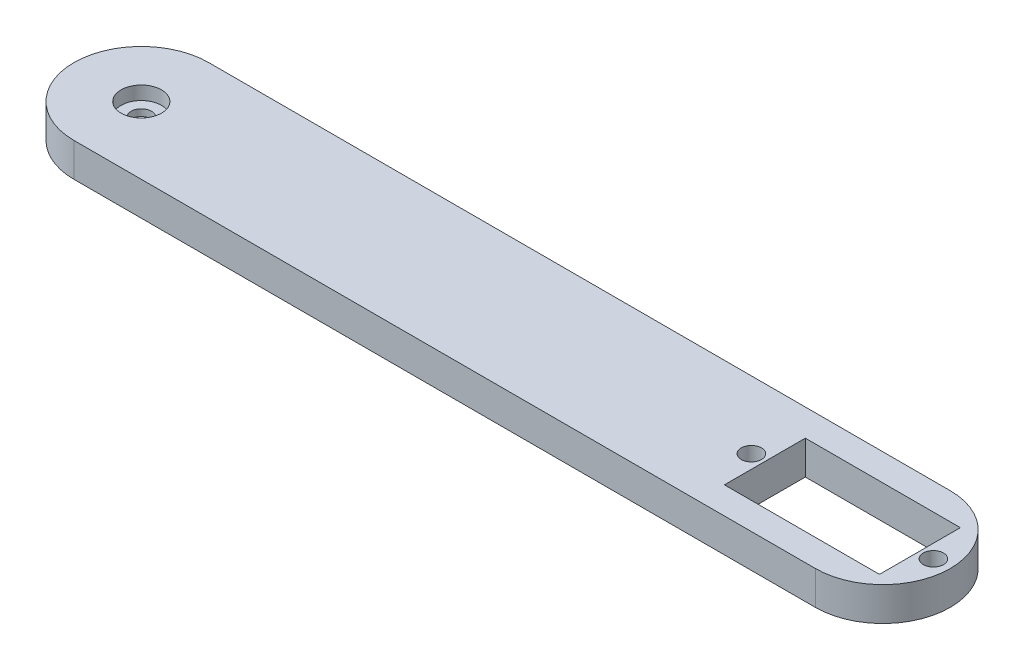
ISO-10303-21;
HEADER;
FILE_DESCRIPTION(('STEP AP214'),'2;1');
FILE_NAME('part.step','',(''),(''),'','','');
FILE_SCHEMA(('AUTOMOTIVE_DESIGN { 1 0 10303 214 1 1 1 1 }'));
ENDSEC;
DATA;
#1=APPLICATION_CONTEXT('core data for automotive mechanical design processes');
#2=APPLICATION_PROTOCOL_DEFINITION('international standard','automotive_design',2000,#1);
#3=PRODUCT_CONTEXT('',#1,'mechanical');
#4=PRODUCT('Part','Part','',(#3));
#5=PRODUCT_RELATED_PRODUCT_CATEGORY('part','',(#4));
#6=PRODUCT_DEFINITION_FORMATION('','',#4);
#7=PRODUCT_DEFINITION_CONTEXT('part definition',#1,'design');
#8=PRODUCT_DEFINITION('design','',#6,#7);
#9=PRODUCT_DEFINITION_SHAPE('','',#8);
#10=(LENGTH_UNIT() NAMED_UNIT(*) SI_UNIT(.MILLI.,.METRE.));
#11=(NAMED_UNIT(*) PLANE_ANGLE_UNIT() SI_UNIT($,.RADIAN.));
#12=(NAMED_UNIT(*) SI_UNIT($,.STERADIAN.) SOLID_ANGLE_UNIT());
#13=UNCERTAINTY_MEASURE_WITH_UNIT(LENGTH_MEASURE(1.E-05),#10,'distance_accuracy_value','');
#14=(GEOMETRIC_REPRESENTATION_CONTEXT(3) GLOBAL_UNCERTAINTY_ASSIGNED_CONTEXT((#13)) GLOBAL_UNIT_ASSIGNED_CONTEXT((#10,
#11,#12)) REPRESENTATION_CONTEXT('',''));
#15=CARTESIAN_POINT('',(0.,0.,0.));
#16=DIRECTION('',(0.,0.,1.));
#17=DIRECTION('',(1.,0.,0.));
#18=AXIS2_PLACEMENT_3D('',#15,#16,#17);
#19=CARTESIAN_POINT('',(40.,5.,0.));
#20=DIRECTION('',(0.,-1.,0.));
#21=DIRECTION('',(0.,0.,-1.));
#22=AXIS2_PLACEMENT_3D('',#19,#20,#21);
#23=CYLINDRICAL_SURFACE('',#22,10.);
#24=CARTESIAN_POINT('',(40.,0.,0.));
#25=DIRECTION('',(0.,1.,0.));
#26=DIRECTION('',(0.,0.,1.));
#27=AXIS2_PLACEMENT_3D('',#24,#25,#26);
#28=CIRCLE('',#27,10.);
#29=CARTESIAN_POINT('',(40.,0.,10.));
#30=VERTEX_POINT('',#29);
#31=CARTESIAN_POINT('',(40.,0.,-10.));
#32=VERTEX_POINT('',#31);
#33=EDGE_CURVE('E277',#30,#32,#28,.T.);
#34=ORIENTED_EDGE('',*,*,#33,.T.);
#35=DIRECTION('',(0.,-1.,0.));
#36=VECTOR('',#35,1.);
#37=CARTESIAN_POINT('',(40.,5.,-10.));
#38=LINE('',#37,#36);
#39=CARTESIAN_POINT('',(40.,5.,-10.));
#40=VERTEX_POINT('',#39);
#41=EDGE_CURVE('E325',#40,#32,#38,.T.);
#42=ORIENTED_EDGE('',*,*,#41,.F.);
#43=CARTESIAN_POINT('',(40.,5.,0.));
#44=DIRECTION('',(0.,1.,0.));
#45=DIRECTION('',(0.,0.,1.));
#46=AXIS2_PLACEMENT_3D('',#43,#44,#45);
#47=CIRCLE('',#46,10.);
#48=CARTESIAN_POINT('',(40.,5.,10.));
#49=VERTEX_POINT('',#48);
#50=EDGE_CURVE('E286',#49,#40,#47,.T.);
#51=ORIENTED_EDGE('',*,*,#50,.F.);
#52=DIRECTION('',(0.,-1.,0.));
#53=VECTOR('',#52,1.);
#54=CARTESIAN_POINT('',(40.,5.,10.));
#55=LINE('',#54,#53);
#56=EDGE_CURVE('E300',#49,#30,#55,.T.);
#57=ORIENTED_EDGE('',*,*,#56,.T.);
#58=EDGE_LOOP('',(#34,#42,#51,#57));
#59=FACE_BOUND('',#58,.T.);
#60=ADVANCED_FACE('F43',(#59),#23,.T.);
#61=CARTESIAN_POINT('',(-40.,5.,-10.));
#62=DIRECTION('',(0.,0.,1.));
#63=DIRECTION('',(1.,0.,0.));
#64=AXIS2_PLACEMENT_3D('',#61,#62,#63);
#65=PLANE('',#64);
#66=DIRECTION('',(-1.,0.,0.));
#67=VECTOR('',#66,1.);
#68=CARTESIAN_POINT('',(-40.,0.,-10.));
#69=LINE('',#68,#67);
#70=CARTESIAN_POINT('',(-70.,0.,-9.99999999999999));
#71=VERTEX_POINT('',#70);
#72=EDGE_CURVE('E304',#32,#71,#69,.T.);
#73=ORIENTED_EDGE('',*,*,#72,.T.);
#74=DIRECTION('',(0.,-1.,0.));
#75=VECTOR('',#74,1.);
#76=CARTESIAN_POINT('',(-70.,5.,-9.99999999999999));
#77=LINE('',#76,#75);
#78=CARTESIAN_POINT('',(-70.,5.,-9.99999999999999));
#79=VERTEX_POINT('',#78);
#80=EDGE_CURVE('E321',#79,#71,#77,.T.);
#81=ORIENTED_EDGE('',*,*,#80,.F.);
#82=DIRECTION('',(-1.,0.,0.));
#83=VECTOR('',#82,1.);
#84=CARTESIAN_POINT('',(-40.,5.,-10.));
#85=LINE('',#84,#83);
#86=EDGE_CURVE('E290',#40,#79,#85,.T.);
#87=ORIENTED_EDGE('',*,*,#86,.F.);
#88=ORIENTED_EDGE('',*,*,#41,.T.);
#89=EDGE_LOOP('',(#73,#81,#87,#88));
#90=FACE_BOUND('',#89,.T.);
#91=ADVANCED_FACE('F346',(#90),#65,.F.);
#92=CARTESIAN_POINT('',(-70.,5.,0.));
#93=DIRECTION('',(0.,-1.,0.));
#94=DIRECTION('',(0.,0.,-1.));
#95=AXIS2_PLACEMENT_3D('',#92,#93,#94);
#96=CYLINDRICAL_SURFACE('',#95,10.);
#97=CARTESIAN_POINT('',(-70.,0.,0.));
#98=DIRECTION('',(0.,1.,0.));
#99=DIRECTION('',(0.,0.,1.));
#100=AXIS2_PLACEMENT_3D('',#97,#98,#99);
#101=CIRCLE('',#100,10.);
#102=CARTESIAN_POINT('',(-78.6702117455341,0.,-4.98271294453153));
#103=VERTEX_POINT('',#102);
#104=EDGE_CURVE('E308',#71,#103,#101,.T.);
#105=ORIENTED_EDGE('',*,*,#104,.T.);
#106=DIRECTION('',(0.,-1.,0.));
#107=VECTOR('',#106,1.);
#108=CARTESIAN_POINT('',(-78.6702117455341,5.,-4.98271294453153));
#109=LINE('',#108,#107);
#110=CARTESIAN_POINT('',(-78.6702117455341,2.,-4.98271294453153));
#111=VERTEX_POINT('',#110);
#112=EDGE_CURVE('E216',#103,#111,#109,.F.);
#113=ORIENTED_EDGE('',*,*,#112,.T.);
#114=CARTESIAN_POINT('',(-70.,2.,0.));
#115=DIRECTION('',(0.,-1.,0.));
#116=DIRECTION('',(0.,0.,-1.));
#117=AXIS2_PLACEMENT_3D('',#114,#115,#116);
#118=CIRCLE('',#117,10.);
#119=CARTESIAN_POINT('',(-78.6317978282409,2.,5.04896684999772));
#120=VERTEX_POINT('',#119);
#121=EDGE_CURVE('E11',#120,#111,#118,.T.);
#122=ORIENTED_EDGE('',*,*,#121,.F.);
#123=DIRECTION('',(0.,-1.,0.));
#124=VECTOR('',#123,1.);
#125=CARTESIAN_POINT('',(-78.6317978282409,5.,5.04896684999772));
#126=LINE('',#125,#124);
#127=CARTESIAN_POINT('',(-78.6317978282409,0.,5.04896684999772));
#128=VERTEX_POINT('',#127);
#129=EDGE_CURVE('E205',#128,#120,#126,.F.);
#130=ORIENTED_EDGE('',*,*,#129,.F.);
#131=CARTESIAN_POINT('',(-70.,0.,10.));
#132=VERTEX_POINT('',#131);
#133=EDGE_CURVE('E307',#128,#132,#101,.T.);
#134=ORIENTED_EDGE('',*,*,#133,.T.);
#135=DIRECTION('',(0.,-1.,0.));
#136=VECTOR('',#135,1.);
#137=CARTESIAN_POINT('',(-70.,5.,10.));
#138=LINE('',#137,#136);
#139=CARTESIAN_POINT('',(-70.,5.,10.));
#140=VERTEX_POINT('',#139);
#141=EDGE_CURVE('E317',#140,#132,#138,.T.);
#142=ORIENTED_EDGE('',*,*,#141,.F.);
#143=CARTESIAN_POINT('',(-70.,5.,0.));
#144=DIRECTION('',(0.,1.,0.));
#145=DIRECTION('',(0.,0.,1.));
#146=AXIS2_PLACEMENT_3D('',#143,#144,#145);
#147=CIRCLE('',#146,10.);
#148=EDGE_CURVE('E294',#79,#140,#147,.T.);
#149=ORIENTED_EDGE('',*,*,#148,.F.);
#150=ORIENTED_EDGE('',*,*,#80,.T.);
#151=EDGE_LOOP('',(#105,#113,#122,#130,#134,#142,#149,#150));
#152=FACE_BOUND('',#151,.T.);
#153=ADVANCED_FACE('F340',(#152),#96,.T.);
#154=CARTESIAN_POINT('',(-40.,5.,10.));
#155=DIRECTION('',(0.,0.,-1.));
#156=DIRECTION('',(-1.,0.,0.));
#157=AXIS2_PLACEMENT_3D('',#154,#155,#156);
#158=PLANE('',#157);
#159=DIRECTION('',(1.,0.,0.));
#160=VECTOR('',#159,1.);
#161=CARTESIAN_POINT('',(-40.,0.,10.));
#162=LINE('',#161,#160);
#163=EDGE_CURVE('E291',#132,#30,#162,.T.);
#164=ORIENTED_EDGE('',*,*,#163,.T.);
#165=ORIENTED_EDGE('',*,*,#56,.F.);
#166=DIRECTION('',(1.,0.,0.));
#167=VECTOR('',#166,1.);
#168=CARTESIAN_POINT('',(-40.,5.,10.));
#169=LINE('',#168,#167);
#170=EDGE_CURVE('E297',#140,#49,#169,.T.);
#171=ORIENTED_EDGE('',*,*,#170,.F.);
#172=ORIENTED_EDGE('',*,*,#141,.T.);
#173=EDGE_LOOP('',(#164,#165,#171,#172));
#174=FACE_BOUND('',#173,.T.);
#175=ADVANCED_FACE('F356',(#174),#158,.F.);
#176=CARTESIAN_POINT('',(40.,5.,0.));
#177=DIRECTION('',(0.,1.,0.));
#178=DIRECTION('',(0.,0.,1.));
#179=AXIS2_PLACEMENT_3D('',#176,#177,#178);
#180=PLANE('',#179);
#181=CARTESIAN_POINT('',(-70.,5.,0.));
#182=DIRECTION('',(0.,1.,0.));
#183=DIRECTION('',(0.,0.,1.));
#184=AXIS2_PLACEMENT_3D('',#181,#182,#183);
#185=CIRCLE('',#184,3.00000000000001);
#186=CARTESIAN_POINT('',(-70.,5.,3.00000000000001));
#187=VERTEX_POINT('',#186);
#188=EDGE_CURVE('E220',#187,#187,#185,.T.);
#189=ORIENTED_EDGE('',*,*,#188,.F.);
#190=EDGE_LOOP('',(#189));
#191=FACE_BOUND('',#190,.T.);
#192=CARTESIAN_POINT('',(47.5,5.,0.));
#193=DIRECTION('',(0.,1.,0.));
#194=DIRECTION('',(0.,0.,1.));
#195=AXIS2_PLACEMENT_3D('',#192,#193,#194);
#196=CIRCLE('',#195,1.5);
#197=CARTESIAN_POINT('',(47.5,5.,1.5));
#198=VERTEX_POINT('',#197);
#199=EDGE_CURVE('E237',#198,#198,#196,.T.);
#200=ORIENTED_EDGE('',*,*,#199,.F.);
#201=EDGE_LOOP('',(#200));
#202=FACE_BOUND('',#201,.T.);
#203=CARTESIAN_POINT('',(20.5,5.,0.));
#204=DIRECTION('',(0.,1.,0.));
#205=DIRECTION('',(0.,0.,1.));
#206=AXIS2_PLACEMENT_3D('',#203,#204,#205);
#207=CIRCLE('',#206,1.5);
#208=CARTESIAN_POINT('',(20.5,5.,1.5));
#209=VERTEX_POINT('',#208);
#210=EDGE_CURVE('E229',#209,#209,#207,.T.);
#211=ORIENTED_EDGE('',*,*,#210,.F.);
#212=EDGE_LOOP('',(#211));
#213=FACE_BOUND('',#212,.T.);
#214=DIRECTION('',(0.,0.,1.));
#215=VECTOR('',#214,1.);
#216=CARTESIAN_POINT('',(22.5,5.,0.));
#217=LINE('',#216,#215);
#218=CARTESIAN_POINT('',(22.5,5.,-6.));
#219=VERTEX_POINT('',#218);
#220=CARTESIAN_POINT('',(22.5,5.,6.));
#221=VERTEX_POINT('',#220);
#222=EDGE_CURVE('E67',#219,#221,#217,.T.);
#223=ORIENTED_EDGE('',*,*,#222,.F.);
#224=DIRECTION('',(1.,0.,0.));
#225=VECTOR('',#224,1.);
#226=CARTESIAN_POINT('',(0.,5.,-6.));
#227=LINE('',#226,#225);
#228=CARTESIAN_POINT('',(45.5,5.,-6.));
#229=VERTEX_POINT('',#228);
#230=EDGE_CURVE('E249',#219,#229,#227,.T.);
#231=ORIENTED_EDGE('',*,*,#230,.T.);
#232=DIRECTION('',(0.,0.,1.));
#233=VECTOR('',#232,1.);
#234=CARTESIAN_POINT('',(45.5,5.,0.));
#235=LINE('',#234,#233);
#236=CARTESIAN_POINT('',(45.5,5.,6.));
#237=VERTEX_POINT('',#236);
#238=EDGE_CURVE('E267',#229,#237,#235,.T.);
#239=ORIENTED_EDGE('',*,*,#238,.T.);
#240=DIRECTION('',(1.,0.,0.));
#241=VECTOR('',#240,1.);
#242=CARTESIAN_POINT('',(0.,5.,6.));
#243=LINE('',#242,#241);
#244=EDGE_CURVE('E263',#221,#237,#243,.T.);
#245=ORIENTED_EDGE('',*,*,#244,.F.);
#246=EDGE_LOOP('',(#223,#231,#239,#245));
#247=FACE_BOUND('',#246,.T.);
#248=ORIENTED_EDGE('',*,*,#50,.T.);
#249=ORIENTED_EDGE('',*,*,#86,.T.);
#250=ORIENTED_EDGE('',*,*,#148,.T.);
#251=ORIENTED_EDGE('',*,*,#170,.T.);
#252=EDGE_LOOP('',(#248,#249,#250,#251));
#253=FACE_BOUND('',#252,.T.);
#254=ADVANCED_FACE('F394',(#191,#202,#213,#247,#253),#180,.T.);
#255=CARTESIAN_POINT('',(40.,0.,0.));
#256=DIRECTION('',(0.,1.,0.));
#257=DIRECTION('',(0.,0.,1.));
#258=AXIS2_PLACEMENT_3D('',#255,#256,#257);
#259=PLANE('',#258);
#260=DIRECTION('',(0.985030467155704,0.,0.172380331752248));
#261=VECTOR('',#260,1.);
#262=CARTESIAN_POINT('',(-0.97634930260764,0.,5.57913887204366));
#263=LINE('',#262,#261);
#264=CARTESIAN_POINT('',(-70.,0.,-6.49999999999999));
#265=VERTEX_POINT('',#264);
#266=CARTESIAN_POINT('',(-50.,0.,-3.));
#267=VERTEX_POINT('',#266);
#268=EDGE_CURVE('E59',#265,#267,#263,.T.);
#269=ORIENTED_EDGE('',*,*,#268,.F.);
#270=DIRECTION('',(-0.985030467155704,0.,0.172380331752248));
#271=VECTOR('',#270,1.);
#272=CARTESIAN_POINT('',(35.6276531231049,0.,-24.9848392965433));
#273=LINE('',#272,#271);
#274=EDGE_CURVE('E52',#265,#103,#273,.T.);
#275=ORIENTED_EDGE('',*,*,#274,.T.);
#276=ORIENTED_EDGE('',*,*,#104,.F.);
#277=ORIENTED_EDGE('',*,*,#72,.F.);
#278=ORIENTED_EDGE('',*,*,#33,.F.);
#279=ORIENTED_EDGE('',*,*,#163,.F.);
#280=ORIENTED_EDGE('',*,*,#133,.F.);
#281=DIRECTION('',(-0.984142689594404,0.,-0.177378596560839));
#282=VECTOR('',#281,1.);
#283=CARTESIAN_POINT('',(35.3860908053863,0.,25.5991708829088));
#284=LINE('',#283,#282);
#285=CARTESIAN_POINT('',(-71.1529608776454,0.,6.39692748236363));
#286=VERTEX_POINT('',#285);
#287=EDGE_CURVE('E329',#286,#128,#284,.T.);
#288=ORIENTED_EDGE('',*,*,#287,.F.);
#289=CARTESIAN_POINT('',(-70.,0.,0.));
#290=DIRECTION('',(0.,-1.,0.));
#291=DIRECTION('',(0.,0.,-1.));
#292=AXIS2_PLACEMENT_3D('',#289,#290,#291);
#293=CIRCLE('',#292,6.5);
#294=CARTESIAN_POINT('',(-68.8470391223545,0.,6.39692748236363));
#295=VERTEX_POINT('',#294);
#296=EDGE_CURVE('E174',#295,#286,#293,.T.);
#297=ORIENTED_EDGE('',*,*,#296,.F.);
#298=DIRECTION('',(-0.984142689594404,0.,0.177378596560839));
#299=VECTOR('',#298,1.);
#300=CARTESIAN_POINT('',(-1.04946077860705,0.,-5.82268195434692));
#301=LINE('',#300,#299);
#302=CARTESIAN_POINT('',(-50.,0.,3.00000000000001));
#303=VERTEX_POINT('',#302);
#304=EDGE_CURVE('E178',#303,#295,#301,.T.);
#305=ORIENTED_EDGE('',*,*,#304,.F.);
#306=CARTESIAN_POINT('',(-50.,0.,0.));
#307=DIRECTION('',(0.,-1.,0.));
#308=DIRECTION('',(0.,0.,-1.));
#309=AXIS2_PLACEMENT_3D('',#306,#307,#308);
#310=CIRCLE('',#309,3.);
#311=EDGE_CURVE('E196',#267,#303,#310,.T.);
#312=ORIENTED_EDGE('',*,*,#311,.F.);
#313=EDGE_LOOP('',(#269,#275,#276,#277,#278,#279,#280,#288,#297,#305,#312));
#314=FACE_BOUND('',#313,.T.);
#315=CARTESIAN_POINT('',(47.5,0.,0.));
#316=DIRECTION('',(0.,1.,0.));
#317=DIRECTION('',(0.,0.,1.));
#318=AXIS2_PLACEMENT_3D('',#315,#316,#317);
#319=CIRCLE('',#318,1.5);
#320=CARTESIAN_POINT('',(47.5,0.,1.5));
#321=VERTEX_POINT('',#320);
#322=EDGE_CURVE('E225',#321,#321,#319,.T.);
#323=ORIENTED_EDGE('',*,*,#322,.T.);
#324=EDGE_LOOP('',(#323));
#325=FACE_BOUND('',#324,.T.);
#326=CARTESIAN_POINT('',(20.5,0.,0.));
#327=DIRECTION('',(0.,1.,0.));
#328=DIRECTION('',(0.,0.,1.));
#329=AXIS2_PLACEMENT_3D('',#326,#327,#328);
#330=CIRCLE('',#329,1.5);
#331=CARTESIAN_POINT('',(20.5,0.,1.5));
#332=VERTEX_POINT('',#331);
#333=EDGE_CURVE('E233',#332,#332,#330,.T.);
#334=ORIENTED_EDGE('',*,*,#333,.T.);
#335=EDGE_LOOP('',(#334));
#336=FACE_BOUND('',#335,.T.);
#337=DIRECTION('',(1.,0.,0.));
#338=VECTOR('',#337,1.);
#339=CARTESIAN_POINT('',(0.,0.,-6.));
#340=LINE('',#339,#338);
#341=CARTESIAN_POINT('',(22.5,0.,-6.));
#342=VERTEX_POINT('',#341);
#343=CARTESIAN_POINT('',(45.5,0.,-6.));
#344=VERTEX_POINT('',#343);
#345=EDGE_CURVE('E257',#342,#344,#340,.T.);
#346=ORIENTED_EDGE('',*,*,#345,.F.);
#347=DIRECTION('',(0.,0.,1.));
#348=VECTOR('',#347,1.);
#349=CARTESIAN_POINT('',(22.5,0.,0.));
#350=LINE('',#349,#348);
#351=CARTESIAN_POINT('',(22.5,0.,6.));
#352=VERTEX_POINT('',#351);
#353=EDGE_CURVE('E244',#342,#352,#350,.T.);
#354=ORIENTED_EDGE('',*,*,#353,.T.);
#355=DIRECTION('',(1.,0.,0.));
#356=VECTOR('',#355,1.);
#357=CARTESIAN_POINT('',(0.,0.,6.));
#358=LINE('',#357,#356);
#359=CARTESIAN_POINT('',(45.5,0.,6.));
#360=VERTEX_POINT('',#359);
#361=EDGE_CURVE('E248',#352,#360,#358,.T.);
#362=ORIENTED_EDGE('',*,*,#361,.T.);
#363=DIRECTION('',(0.,0.,1.));
#364=VECTOR('',#363,1.);
#365=CARTESIAN_POINT('',(45.5,0.,0.));
#366=LINE('',#365,#364);
#367=EDGE_CURVE('E253',#344,#360,#366,.T.);
#368=ORIENTED_EDGE('',*,*,#367,.F.);
#369=EDGE_LOOP('',(#346,#354,#362,#368));
#370=FACE_BOUND('',#369,.T.);
#371=ADVANCED_FACE('F336',(#314,#325,#336,#370),#259,.F.);
#372=CARTESIAN_POINT('',(22.5,0.,0.));
#373=DIRECTION('',(-1.,0.,0.));
#374=DIRECTION('',(0.,0.,1.));
#375=AXIS2_PLACEMENT_3D('',#372,#373,#374);
#376=PLANE('',#375);
#377=ORIENTED_EDGE('',*,*,#222,.T.);
#378=DIRECTION('',(0.,1.,0.));
#379=VECTOR('',#378,1.);
#380=CARTESIAN_POINT('',(22.5,0.,6.));
#381=LINE('',#380,#379);
#382=EDGE_CURVE('E260',#352,#221,#381,.T.);
#383=ORIENTED_EDGE('',*,*,#382,.F.);
#384=ORIENTED_EDGE('',*,*,#353,.F.);
#385=DIRECTION('',(0.,1.,0.));
#386=VECTOR('',#385,1.);
#387=CARTESIAN_POINT('',(22.5,0.,-6.));
#388=LINE('',#387,#386);
#389=EDGE_CURVE('E274',#342,#219,#388,.T.);
#390=ORIENTED_EDGE('',*,*,#389,.T.);
#391=EDGE_LOOP('',(#377,#383,#384,#390));
#392=FACE_BOUND('',#391,.T.);
#393=ADVANCED_FACE('F397',(#392),#376,.F.);
#394=CARTESIAN_POINT('',(0.,0.,-6.));
#395=DIRECTION('',(0.,0.,1.));
#396=DIRECTION('',(1.,0.,0.));
#397=AXIS2_PLACEMENT_3D('',#394,#395,#396);
#398=PLANE('',#397);
#399=ORIENTED_EDGE('',*,*,#230,.F.);
#400=ORIENTED_EDGE('',*,*,#389,.F.);
#401=ORIENTED_EDGE('',*,*,#345,.T.);
#402=DIRECTION('',(0.,1.,0.));
#403=VECTOR('',#402,1.);
#404=CARTESIAN_POINT('',(45.5,0.,-6.));
#405=LINE('',#404,#403);
#406=EDGE_CURVE('E278',#344,#229,#405,.T.);
#407=ORIENTED_EDGE('',*,*,#406,.T.);
#408=EDGE_LOOP('',(#399,#400,#401,#407));
#409=FACE_BOUND('',#408,.T.);
#410=ADVANCED_FACE('F403',(#409),#398,.T.);
#411=CARTESIAN_POINT('',(45.5,0.,0.));
#412=DIRECTION('',(-1.,0.,0.));
#413=DIRECTION('',(0.,0.,1.));
#414=AXIS2_PLACEMENT_3D('',#411,#412,#413);
#415=PLANE('',#414);
#416=ORIENTED_EDGE('',*,*,#238,.F.);
#417=ORIENTED_EDGE('',*,*,#406,.F.);
#418=ORIENTED_EDGE('',*,*,#367,.T.);
#419=DIRECTION('',(0.,1.,0.));
#420=VECTOR('',#419,1.);
#421=CARTESIAN_POINT('',(45.5,0.,6.));
#422=LINE('',#421,#420);
#423=EDGE_CURVE('E281',#360,#237,#422,.T.);
#424=ORIENTED_EDGE('',*,*,#423,.T.);
#425=EDGE_LOOP('',(#416,#417,#418,#424));
#426=FACE_BOUND('',#425,.T.);
#427=ADVANCED_FACE('F408',(#426),#415,.T.);
#428=CARTESIAN_POINT('',(0.,0.,6.));
#429=DIRECTION('',(0.,0.,1.));
#430=DIRECTION('',(1.,0.,0.));
#431=AXIS2_PLACEMENT_3D('',#428,#429,#430);
#432=PLANE('',#431);
#433=ORIENTED_EDGE('',*,*,#244,.T.);
#434=ORIENTED_EDGE('',*,*,#423,.F.);
#435=ORIENTED_EDGE('',*,*,#361,.F.);
#436=ORIENTED_EDGE('',*,*,#382,.T.);
#437=EDGE_LOOP('',(#433,#434,#435,#436));
#438=FACE_BOUND('',#437,.T.);
#439=ADVANCED_FACE('F404',(#438),#432,.F.);
#440=CARTESIAN_POINT('',(20.5,0.,0.));
#441=DIRECTION('',(0.,1.,0.));
#442=DIRECTION('',(0.,0.,1.));
#443=AXIS2_PLACEMENT_3D('',#440,#441,#442);
#444=CYLINDRICAL_SURFACE('',#443,1.5);
#445=ORIENTED_EDGE('',*,*,#333,.F.);
#446=EDGE_LOOP('',(#445));
#447=FACE_BOUND('',#446,.T.);
#448=ORIENTED_EDGE('',*,*,#210,.T.);
#449=EDGE_LOOP('',(#448));
#450=FACE_BOUND('',#449,.T.);
#451=ADVANCED_FACE('F407',(#447,#450),#444,.F.);
#452=CARTESIAN_POINT('',(47.5,0.,0.));
#453=DIRECTION('',(0.,1.,0.));
#454=DIRECTION('',(0.,0.,1.));
#455=AXIS2_PLACEMENT_3D('',#452,#453,#454);
#456=CYLINDRICAL_SURFACE('',#455,1.5);
#457=ORIENTED_EDGE('',*,*,#322,.F.);
#458=EDGE_LOOP('',(#457));
#459=FACE_BOUND('',#458,.T.);
#460=ORIENTED_EDGE('',*,*,#199,.T.);
#461=EDGE_LOOP('',(#460));
#462=FACE_BOUND('',#461,.T.);
#463=ADVANCED_FACE('F416',(#459,#462),#456,.F.);
#464=CARTESIAN_POINT('',(-70.,3.,0.));
#465=DIRECTION('',(0.,1.,0.));
#466=DIRECTION('',(0.,0.,1.));
#467=AXIS2_PLACEMENT_3D('',#464,#465,#466);
#468=CYLINDRICAL_SURFACE('',#467,3.00000000000001);
#469=CARTESIAN_POINT('',(-70.,3.,0.));
#470=DIRECTION('',(0.,1.,0.));
#471=DIRECTION('',(0.,0.,1.));
#472=AXIS2_PLACEMENT_3D('',#469,#470,#471);
#473=CIRCLE('',#472,3.00000000000001);
#474=CARTESIAN_POINT('',(-70.,3.,3.00000000000001));
#475=VERTEX_POINT('',#474);
#476=EDGE_CURVE('E221',#475,#475,#473,.T.);
#477=ORIENTED_EDGE('',*,*,#476,.F.);
#478=EDGE_LOOP('',(#477));
#479=FACE_BOUND('',#478,.T.);
#480=ORIENTED_EDGE('',*,*,#188,.T.);
#481=EDGE_LOOP('',(#480));
#482=FACE_BOUND('',#481,.T.);
#483=ADVANCED_FACE('F419',(#479,#482),#468,.F.);
#484=CARTESIAN_POINT('',(-70.,3.,0.));
#485=DIRECTION('',(0.,1.,0.));
#486=DIRECTION('',(0.,0.,1.));
#487=AXIS2_PLACEMENT_3D('',#484,#485,#486);
#488=PLANE('',#487);
#489=CARTESIAN_POINT('',(-70.,3.,0.));
#490=DIRECTION('',(0.,1.,0.));
#491=DIRECTION('',(0.,0.,1.));
#492=AXIS2_PLACEMENT_3D('',#489,#490,#491);
#493=CIRCLE('',#492,1.5);
#494=CARTESIAN_POINT('',(-70.,3.,1.5));
#495=VERTEX_POINT('',#494);
#496=EDGE_CURVE('E181',#495,#495,#493,.T.);
#497=ORIENTED_EDGE('',*,*,#496,.F.);
#498=EDGE_LOOP('',(#497));
#499=FACE_BOUND('',#498,.T.);
#500=ORIENTED_EDGE('',*,*,#476,.T.);
#501=EDGE_LOOP('',(#500));
#502=FACE_BOUND('',#501,.T.);
#503=ADVANCED_FACE('F379',(#499,#502),#488,.T.);
#504=CARTESIAN_POINT('',(0.,2.,0.));
#505=DIRECTION('',(0.,-1.,0.));
#506=DIRECTION('',(0.,0.,-1.));
#507=AXIS2_PLACEMENT_3D('',#504,#505,#506);
#508=PLANE('',#507);
#509=CARTESIAN_POINT('',(-70.,2.,0.));
#510=DIRECTION('',(0.,-1.,0.));
#511=DIRECTION('',(0.,0.,-1.));
#512=AXIS2_PLACEMENT_3D('',#509,#510,#511);
#513=CIRCLE('',#512,1.5);
#514=CARTESIAN_POINT('',(-70.,2.,-1.49999999999999));
#515=VERTEX_POINT('',#514);
#516=EDGE_CURVE('E46',#515,#515,#513,.T.);
#517=ORIENTED_EDGE('',*,*,#516,.F.);
#518=EDGE_LOOP('',(#517));
#519=FACE_BOUND('',#518,.T.);
#520=ORIENTED_EDGE('',*,*,#121,.T.);
#521=DIRECTION('',(0.985030467155704,0.,-0.172380331752248));
#522=VECTOR('',#521,1.);
#523=CARTESIAN_POINT('',(-3.18374772589447,2.,-18.1928441479684));
#524=LINE('',#523,#522);
#525=CARTESIAN_POINT('',(-70.,2.,-6.49999999999999));
#526=VERTEX_POINT('',#525);
#527=EDGE_CURVE('E159',#111,#526,#524,.T.);
#528=ORIENTED_EDGE('',*,*,#527,.T.);
#529=DIRECTION('',(0.985030467155704,0.,0.172380331752248));
#530=VECTOR('',#529,1.);
#531=CARTESIAN_POINT('',(-0.97634930260764,2.,5.57913887204366));
#532=LINE('',#531,#530);
#533=CARTESIAN_POINT('',(-50.,2.,-3.));
#534=VERTEX_POINT('',#533);
#535=EDGE_CURVE('E153',#526,#534,#532,.T.);
#536=ORIENTED_EDGE('',*,*,#535,.T.);
#537=CARTESIAN_POINT('',(-50.,2.,0.));
#538=DIRECTION('',(0.,-1.,0.));
#539=DIRECTION('',(0.,0.,-1.));
#540=AXIS2_PLACEMENT_3D('',#537,#538,#539);
#541=CIRCLE('',#540,3.);
#542=CARTESIAN_POINT('',(-50.,2.,3.00000000000001));
#543=VERTEX_POINT('',#542);
#544=EDGE_CURVE('E162',#534,#543,#541,.T.);
#545=ORIENTED_EDGE('',*,*,#544,.T.);
#546=DIRECTION('',(-0.984142689594404,0.,0.177378596560839));
#547=VECTOR('',#546,1.);
#548=CARTESIAN_POINT('',(-1.04946077860705,2.,-5.82268195434692));
#549=LINE('',#548,#547);
#550=CARTESIAN_POINT('',(-68.8470391223545,2.,6.39692748236363));
#551=VERTEX_POINT('',#550);
#552=EDGE_CURVE('E168',#543,#551,#549,.T.);
#553=ORIENTED_EDGE('',*,*,#552,.T.);
#554=CARTESIAN_POINT('',(-70.,2.,0.));
#555=DIRECTION('',(0.,-1.,0.));
#556=DIRECTION('',(0.,0.,-1.));
#557=AXIS2_PLACEMENT_3D('',#554,#555,#556);
#558=CIRCLE('',#557,6.5);
#559=CARTESIAN_POINT('',(-71.1529608776454,2.,6.39692748236363));
#560=VERTEX_POINT('',#559);
#561=EDGE_CURVE('E185',#551,#560,#558,.T.);
#562=ORIENTED_EDGE('',*,*,#561,.T.);
#563=DIRECTION('',(0.984142689594404,0.,0.177378596560839));
#564=VECTOR('',#563,1.);
#565=CARTESIAN_POINT('',(-3.35538253389796,2.,18.6165369190742));
#566=LINE('',#565,#564);
#567=EDGE_CURVE('E189',#120,#560,#566,.T.);
#568=ORIENTED_EDGE('',*,*,#567,.F.);
#569=EDGE_LOOP('',(#520,#528,#536,#545,#553,#562,#568));
#570=FACE_BOUND('',#569,.T.);
#571=ADVANCED_FACE('F170',(#519,#570),#508,.T.);
#572=CARTESIAN_POINT('',(-3.18374772589447,2.,-18.1928441479684));
#573=DIRECTION('',(-0.172380331752248,0.,-0.985030467155704));
#574=DIRECTION('',(-0.985030467155704,0.,0.172380331752248));
#575=AXIS2_PLACEMENT_3D('',#572,#573,#574);
#576=PLANE('',#575);
#577=ORIENTED_EDGE('',*,*,#274,.F.);
#578=DIRECTION('',(0.,-1.,0.));
#579=VECTOR('',#578,1.);
#580=CARTESIAN_POINT('',(-70.,2.,-6.49999999999999));
#581=LINE('',#580,#579);
#582=EDGE_CURVE('E202',#526,#265,#581,.T.);
#583=ORIENTED_EDGE('',*,*,#582,.F.);
#584=ORIENTED_EDGE('',*,*,#527,.F.);
#585=ORIENTED_EDGE('',*,*,#112,.F.);
#586=EDGE_LOOP('',(#577,#583,#584,#585));
#587=FACE_BOUND('',#586,.T.);
#588=ADVANCED_FACE('F371',(#587),#576,.F.);
#589=CARTESIAN_POINT('',(-3.35538253389796,2.,18.6165369190742));
#590=DIRECTION('',(0.177378596560839,0.,-0.984142689594404));
#591=DIRECTION('',(-0.984142689594404,0.,-0.177378596560839));
#592=AXIS2_PLACEMENT_3D('',#589,#590,#591);
#593=PLANE('',#592);
#594=ORIENTED_EDGE('',*,*,#129,.T.);
#595=ORIENTED_EDGE('',*,*,#567,.T.);
#596=DIRECTION('',(0.,-1.,0.));
#597=VECTOR('',#596,1.);
#598=CARTESIAN_POINT('',(-71.1529608776454,2.,6.39692748236363));
#599=LINE('',#598,#597);
#600=EDGE_CURVE('E206',#560,#286,#599,.T.);
#601=ORIENTED_EDGE('',*,*,#600,.T.);
#602=ORIENTED_EDGE('',*,*,#287,.T.);
#603=EDGE_LOOP('',(#594,#595,#601,#602));
#604=FACE_BOUND('',#603,.T.);
#605=ADVANCED_FACE('F363',(#604),#593,.T.);
#606=CARTESIAN_POINT('',(-0.97634930260764,2.,5.57913887204366));
#607=DIRECTION('',(0.172380331752248,0.,-0.985030467155704));
#608=DIRECTION('',(-0.985030467155704,0.,-0.172380331752248));
#609=AXIS2_PLACEMENT_3D('',#606,#607,#608);
#610=PLANE('',#609);
#611=ORIENTED_EDGE('',*,*,#268,.T.);
#612=DIRECTION('',(0.,-1.,0.));
#613=VECTOR('',#612,1.);
#614=CARTESIAN_POINT('',(-50.,2.,-3.));
#615=LINE('',#614,#613);
#616=EDGE_CURVE('E149',#534,#267,#615,.T.);
#617=ORIENTED_EDGE('',*,*,#616,.F.);
#618=ORIENTED_EDGE('',*,*,#535,.F.);
#619=ORIENTED_EDGE('',*,*,#582,.T.);
#620=EDGE_LOOP('',(#611,#617,#618,#619));
#621=FACE_BOUND('',#620,.T.);
#622=ADVANCED_FACE('F151',(#621),#610,.F.);
#623=CARTESIAN_POINT('',(-70.,2.,0.));
#624=DIRECTION('',(0.,-1.,0.));
#625=DIRECTION('',(0.,0.,-1.));
#626=AXIS2_PLACEMENT_3D('',#623,#624,#625);
#627=CYLINDRICAL_SURFACE('',#626,6.5);
#628=ORIENTED_EDGE('',*,*,#296,.T.);
#629=ORIENTED_EDGE('',*,*,#600,.F.);
#630=ORIENTED_EDGE('',*,*,#561,.F.);
#631=DIRECTION('',(0.,-1.,0.));
#632=VECTOR('',#631,1.);
#633=CARTESIAN_POINT('',(-68.8470391223545,2.,6.39692748236363));
#634=LINE('',#633,#632);
#635=EDGE_CURVE('E209',#551,#295,#634,.T.);
#636=ORIENTED_EDGE('',*,*,#635,.T.);
#637=EDGE_LOOP('',(#628,#629,#630,#636));
#638=FACE_BOUND('',#637,.T.);
#639=ADVANCED_FACE('F368',(#638),#627,.F.);
#640=CARTESIAN_POINT('',(-1.04946077860705,2.,-5.82268195434692));
#641=DIRECTION('',(0.177378596560839,0.,0.984142689594404));
#642=DIRECTION('',(0.984142689594404,0.,-0.177378596560839));
#643=AXIS2_PLACEMENT_3D('',#640,#641,#642);
#644=PLANE('',#643);
#645=ORIENTED_EDGE('',*,*,#304,.T.);
#646=ORIENTED_EDGE('',*,*,#635,.F.);
#647=ORIENTED_EDGE('',*,*,#552,.F.);
#648=DIRECTION('',(0.,-1.,0.));
#649=VECTOR('',#648,1.);
#650=CARTESIAN_POINT('',(-50.,2.,3.00000000000001));
#651=LINE('',#650,#649);
#652=EDGE_CURVE('E158',#543,#303,#651,.T.);
#653=ORIENTED_EDGE('',*,*,#652,.T.);
#654=EDGE_LOOP('',(#645,#646,#647,#653));
#655=FACE_BOUND('',#654,.T.);
#656=ADVANCED_FACE('F370',(#655),#644,.F.);
#657=CARTESIAN_POINT('',(-50.,2.,0.));
#658=DIRECTION('',(0.,-1.,0.));
#659=DIRECTION('',(0.,0.,-1.));
#660=AXIS2_PLACEMENT_3D('',#657,#658,#659);
#661=CYLINDRICAL_SURFACE('',#660,3.);
#662=ORIENTED_EDGE('',*,*,#311,.T.);
#663=ORIENTED_EDGE('',*,*,#652,.F.);
#664=ORIENTED_EDGE('',*,*,#544,.F.);
#665=ORIENTED_EDGE('',*,*,#616,.T.);
#666=EDGE_LOOP('',(#662,#663,#664,#665));
#667=FACE_BOUND('',#666,.T.);
#668=ADVANCED_FACE('F163',(#667),#661,.F.);
#669=CARTESIAN_POINT('',(-70.,0.,0.));
#670=DIRECTION('',(0.,1.,0.));
#671=DIRECTION('',(0.,0.,1.));
#672=AXIS2_PLACEMENT_3D('',#669,#670,#671);
#673=CYLINDRICAL_SURFACE('',#672,1.5);
#674=ORIENTED_EDGE('',*,*,#516,.T.);
#675=EDGE_LOOP('',(#674));
#676=FACE_BOUND('',#675,.T.);
#677=ORIENTED_EDGE('',*,*,#496,.T.);
#678=EDGE_LOOP('',(#677));
#679=FACE_BOUND('',#678,.T.);
#680=ADVANCED_FACE('F434',(#676,#679),#673,.F.);
#681=CLOSED_SHELL('',(#60,#91,#153,#175,#254,#371,#393,#410,#427,#439,#451,#463,#483,#503,#571,
#588,#605,#622,#639,#656,#668,#680));
#682=MANIFOLD_SOLID_BREP('B2',#681);
#683=ADVANCED_BREP_SHAPE_REPRESENTATION('',(#18,#682),#14);
#684=SHAPE_DEFINITION_REPRESENTATION(#9,#683);
ENDSEC;
END-ISO-10303-21;
